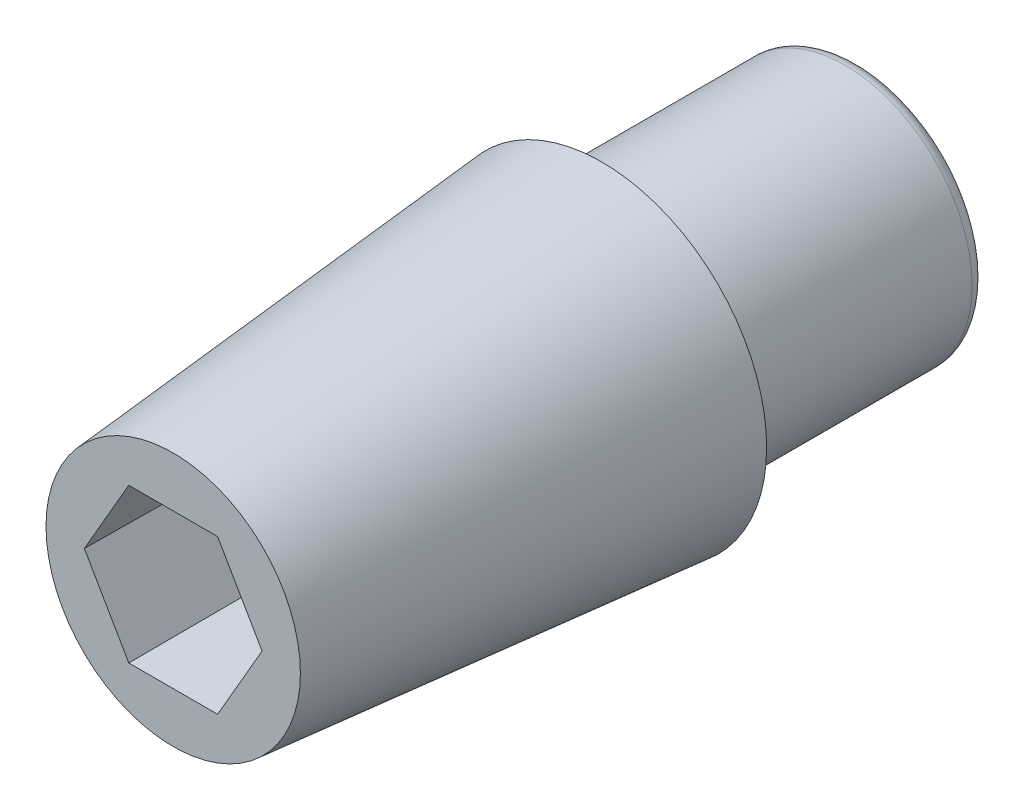
ISO-10303-21;
HEADER;
FILE_DESCRIPTION(('STEP AP214'),'2;1');
FILE_NAME('part.step','',(''),(''),'','','');
FILE_SCHEMA(('AUTOMOTIVE_DESIGN { 1 0 10303 214 1 1 1 1 }'));
ENDSEC;
DATA;
#1=APPLICATION_CONTEXT('core data for automotive mechanical design processes');
#2=APPLICATION_PROTOCOL_DEFINITION('international standard','automotive_design',2000,#1);
#3=PRODUCT_CONTEXT('',#1,'mechanical');
#4=PRODUCT('Part','Part','',(#3));
#5=PRODUCT_RELATED_PRODUCT_CATEGORY('part','',(#4));
#6=PRODUCT_DEFINITION_FORMATION('','',#4);
#7=PRODUCT_DEFINITION_CONTEXT('part definition',#1,'design');
#8=PRODUCT_DEFINITION('design','',#6,#7);
#9=PRODUCT_DEFINITION_SHAPE('','',#8);
#10=(LENGTH_UNIT() NAMED_UNIT(*) SI_UNIT(.MILLI.,.METRE.));
#11=(NAMED_UNIT(*) PLANE_ANGLE_UNIT() SI_UNIT($,.RADIAN.));
#12=(NAMED_UNIT(*) SI_UNIT($,.STERADIAN.) SOLID_ANGLE_UNIT());
#13=UNCERTAINTY_MEASURE_WITH_UNIT(LENGTH_MEASURE(1.E-05),#10,'distance_accuracy_value','');
#14=(GEOMETRIC_REPRESENTATION_CONTEXT(3) GLOBAL_UNCERTAINTY_ASSIGNED_CONTEXT((#13)) GLOBAL_UNIT_ASSIGNED_CONTEXT((#10,
#11,#12)) REPRESENTATION_CONTEXT('',''));
#15=CARTESIAN_POINT('',(0.,0.,0.));
#16=DIRECTION('',(0.,0.,1.));
#17=DIRECTION('',(1.,0.,0.));
#18=AXIS2_PLACEMENT_3D('',#15,#16,#17);
#19=CARTESIAN_POINT('',(0.,0.,15.));
#20=DIRECTION('',(0.,0.,-1.));
#21=DIRECTION('',(-1.,0.,0.));
#22=AXIS2_PLACEMENT_3D('',#19,#20,#21);
#23=CONICAL_SURFACE('',#22,4.44999999999141,0.0872664625001763);
#24=CARTESIAN_POINT('',(0.,0.,0.));
#25=DIRECTION('',(0.,0.,1.));
#26=DIRECTION('',(1.,0.,0.));
#27=AXIS2_PLACEMENT_3D('',#24,#25,#26);
#28=CIRCLE('',#27,5.76232995137573);
#29=CARTESIAN_POINT('',(5.76232995137573,0.,0.));
#30=VERTEX_POINT('',#29);
#31=EDGE_CURVE('E172',#30,#30,#28,.T.);
#32=ORIENTED_EDGE('',*,*,#31,.T.);
#33=EDGE_LOOP('',(#32));
#34=FACE_BOUND('',#33,.T.);
#35=CARTESIAN_POINT('',(0.,0.,15.));
#36=DIRECTION('',(0.,0.,1.));
#37=DIRECTION('',(1.,0.,0.));
#38=AXIS2_PLACEMENT_3D('',#35,#36,#37);
#39=CIRCLE('',#38,4.44999999999141);
#40=CARTESIAN_POINT('',(4.44999999999141,0.,15.));
#41=VERTEX_POINT('',#40);
#42=EDGE_CURVE('E168',#41,#41,#39,.T.);
#43=ORIENTED_EDGE('',*,*,#42,.F.);
#44=EDGE_LOOP('',(#43));
#45=FACE_BOUND('',#44,.T.);
#46=ADVANCED_FACE('F37',(#34,#45),#23,.T.);
#47=CARTESIAN_POINT('',(5.76232995137573,0.,0.));
#48=DIRECTION('',(0.,0.,-1.));
#49=DIRECTION('',(-1.,0.,0.));
#50=AXIS2_PLACEMENT_3D('',#47,#48,#49);
#51=PLANE('',#50);
#52=CARTESIAN_POINT('',(0.,0.,0.));
#53=DIRECTION('',(0.,0.,-1.));
#54=DIRECTION('',(-1.,0.,0.));
#55=AXIS2_PLACEMENT_3D('',#52,#53,#54);
#56=CIRCLE('',#55,4.45);
#57=CARTESIAN_POINT('',(-4.45,0.,0.));
#58=VERTEX_POINT('',#57);
#59=EDGE_CURVE('E137',#58,#58,#56,.T.);
#60=ORIENTED_EDGE('',*,*,#59,.F.);
#61=EDGE_LOOP('',(#60));
#62=FACE_BOUND('',#61,.T.);
#63=ORIENTED_EDGE('',*,*,#31,.F.);
#64=EDGE_LOOP('',(#63));
#65=FACE_BOUND('',#64,.T.);
#66=ADVANCED_FACE('F207',(#62,#65),#51,.T.);
#67=CARTESIAN_POINT('',(0.,0.,15.));
#68=DIRECTION('',(0.,0.,1.));
#69=DIRECTION('',(1.,0.,0.));
#70=AXIS2_PLACEMENT_3D('',#67,#68,#69);
#71=PLANE('',#70);
#72=DIRECTION('',(-0.499999999999999,0.866025403784439,0.));
#73=VECTOR('',#72,1.);
#74=CARTESIAN_POINT('',(3.10844356254791,0.,15.));
#75=LINE('',#74,#73);
#76=CARTESIAN_POINT('',(3.10844356254791,0.,15.));
#77=VERTEX_POINT('',#76);
#78=CARTESIAN_POINT('',(1.55422178127396,2.69199109139669,15.));
#79=VERTEX_POINT('',#78);
#80=EDGE_CURVE('E53',#77,#79,#75,.T.);
#81=ORIENTED_EDGE('',*,*,#80,.F.);
#82=DIRECTION('',(0.5,0.866025403784438,0.));
#83=VECTOR('',#82,1.);
#84=CARTESIAN_POINT('',(1.55422178127396,-2.6919910913967,15.));
#85=LINE('',#84,#83);
#86=CARTESIAN_POINT('',(1.55422178127396,-2.6919910913967,15.));
#87=VERTEX_POINT('',#86);
#88=EDGE_CURVE('E131',#87,#77,#85,.T.);
#89=ORIENTED_EDGE('',*,*,#88,.F.);
#90=DIRECTION('',(1.,0.,0.));
#91=VECTOR('',#90,1.);
#92=CARTESIAN_POINT('',(-1.55422178127395,-2.69199109139669,15.));
#93=LINE('',#92,#91);
#94=CARTESIAN_POINT('',(-1.55422178127395,-2.69199109139669,15.));
#95=VERTEX_POINT('',#94);
#96=EDGE_CURVE('E125',#95,#87,#93,.T.);
#97=ORIENTED_EDGE('',*,*,#96,.F.);
#98=DIRECTION('',(0.5,-0.866025403784439,0.));
#99=VECTOR('',#98,1.);
#100=CARTESIAN_POINT('',(-3.10844356254791,0.,15.));
#101=LINE('',#100,#99);
#102=CARTESIAN_POINT('',(-3.10844356254791,0.,15.));
#103=VERTEX_POINT('',#102);
#104=EDGE_CURVE('E119',#103,#95,#101,.T.);
#105=ORIENTED_EDGE('',*,*,#104,.F.);
#106=DIRECTION('',(-0.5,-0.866025403784439,0.));
#107=VECTOR('',#106,1.);
#108=CARTESIAN_POINT('',(-1.55422178127395,2.6919910913967,15.));
#109=LINE('',#108,#107);
#110=CARTESIAN_POINT('',(-1.55422178127395,2.6919910913967,15.));
#111=VERTEX_POINT('',#110);
#112=EDGE_CURVE('E100',#111,#103,#109,.T.);
#113=ORIENTED_EDGE('',*,*,#112,.F.);
#114=DIRECTION('',(-1.,0.,0.));
#115=VECTOR('',#114,1.);
#116=CARTESIAN_POINT('',(1.55422178127396,2.69199109139669,15.));
#117=LINE('',#116,#115);
#118=EDGE_CURVE('E110',#79,#111,#117,.T.);
#119=ORIENTED_EDGE('',*,*,#118,.F.);
#120=EDGE_LOOP('',(#81,#89,#97,#105,#113,#119));
#121=FACE_BOUND('',#120,.T.);
#122=ORIENTED_EDGE('',*,*,#42,.T.);
#123=EDGE_LOOP('',(#122));
#124=FACE_BOUND('',#123,.T.);
#125=ADVANCED_FACE('F115',(#121,#124),#71,.T.);
#126=CARTESIAN_POINT('',(0.,0.,-9.));
#127=DIRECTION('',(0.,0.,1.));
#128=DIRECTION('',(1.,0.,0.));
#129=AXIS2_PLACEMENT_3D('',#126,#127,#128);
#130=CYLINDRICAL_SURFACE('',#129,4.45);
#131=CARTESIAN_POINT('',(0.,0.,-8.5));
#132=DIRECTION('',(0.,0.,-1.));
#133=DIRECTION('',(-1.,0.,0.));
#134=AXIS2_PLACEMENT_3D('',#131,#132,#133);
#135=CIRCLE('',#134,4.45);
#136=CARTESIAN_POINT('',(-4.45,0.,-8.5));
#137=VERTEX_POINT('',#136);
#138=EDGE_CURVE('E11',#137,#137,#135,.F.);
#139=ORIENTED_EDGE('',*,*,#138,.T.);
#140=EDGE_LOOP('',(#139));
#141=FACE_BOUND('',#140,.T.);
#142=ORIENTED_EDGE('',*,*,#59,.T.);
#143=EDGE_LOOP('',(#142));
#144=FACE_BOUND('',#143,.T.);
#145=ADVANCED_FACE('F263',(#141,#144),#130,.T.);
#146=CARTESIAN_POINT('',(0.,0.,-9.));
#147=DIRECTION('',(0.,0.,-1.));
#148=DIRECTION('',(-1.,0.,0.));
#149=AXIS2_PLACEMENT_3D('',#146,#147,#148);
#150=PLANE('',#149);
#151=CARTESIAN_POINT('',(0.,0.,-9.));
#152=DIRECTION('',(0.,0.,-1.));
#153=DIRECTION('',(-1.,0.,0.));
#154=AXIS2_PLACEMENT_3D('',#151,#152,#153);
#155=CIRCLE('',#154,3.95);
#156=CARTESIAN_POINT('',(-3.95,0.,-9.));
#157=VERTEX_POINT('',#156);
#158=EDGE_CURVE('E46',#157,#157,#155,.T.);
#159=ORIENTED_EDGE('',*,*,#158,.T.);
#160=EDGE_LOOP('',(#159));
#161=FACE_BOUND('',#160,.T.);
#162=ADVANCED_FACE('F195',(#161),#150,.T.);
#163=CARTESIAN_POINT('',(3.10844356254791,0.,15.));
#164=DIRECTION('',(0.865992428190713,0.499980961532085,-0.00872653549837051));
#165=DIRECTION('',(-0.499999999999999,0.866025403784439,0.));
#166=AXIS2_PLACEMENT_3D('',#163,#164,#165);
#167=PLANE('',#166);
#168=ORIENTED_EDGE('',*,*,#80,.T.);
#169=DIRECTION('',(0.00503820367424761,0.00872642474267705,0.999949231718764));
#170=VECTOR('',#169,1.);
#171=CARTESIAN_POINT('',(1.5541428781084,2.69185442710508,14.9843398233026));
#172=LINE('',#171,#170);
#173=CARTESIAN_POINT('',(1.44337567297411,2.50000000000008,-7.));
#174=VERTEX_POINT('',#173);
#175=EDGE_CURVE('E78',#174,#79,#172,.T.);
#176=ORIENTED_EDGE('',*,*,#175,.F.);
#177=DIRECTION('',(-0.499999999999999,0.866025403784439,0.));
#178=VECTOR('',#177,1.);
#179=CARTESIAN_POINT('',(2.16506350946116,1.25000000000004,-7.));
#180=LINE('',#179,#178);
#181=CARTESIAN_POINT('',(2.88675134594822,0.,-7.));
#182=VERTEX_POINT('',#181);
#183=EDGE_CURVE('E134',#182,#174,#180,.T.);
#184=ORIENTED_EDGE('',*,*,#183,.F.);
#185=DIRECTION('',(0.0100764073484952,0.,0.999949231718764));
#186=VECTOR('',#185,1.);
#187=CARTESIAN_POINT('',(3.1082857562168,0.,14.9843398233026));
#188=LINE('',#187,#186);
#189=EDGE_CURVE('E61',#182,#77,#188,.T.);
#190=ORIENTED_EDGE('',*,*,#189,.T.);
#191=EDGE_LOOP('',(#168,#176,#184,#190));
#192=FACE_BOUND('',#191,.T.);
#193=ADVANCED_FACE('F243',(#192),#167,.F.);
#194=CARTESIAN_POINT('',(1.55422178127396,-2.6919910913967,15.));
#195=DIRECTION('',(0.865992428190713,-0.499980961532086,-0.00872653549837051));
#196=DIRECTION('',(0.5,0.866025403784439,0.));
#197=AXIS2_PLACEMENT_3D('',#194,#195,#196);
#198=PLANE('',#197);
#199=ORIENTED_EDGE('',*,*,#88,.T.);
#200=ORIENTED_EDGE('',*,*,#189,.F.);
#201=DIRECTION('',(0.5,0.866025403784439,0.));
#202=VECTOR('',#201,1.);
#203=CARTESIAN_POINT('',(2.16506350946116,-1.25000000000004,-7.));
#204=LINE('',#203,#202);
#205=CARTESIAN_POINT('',(1.44337567297411,-2.50000000000008,-7.));
#206=VERTEX_POINT('',#205);
#207=EDGE_CURVE('E139',#206,#182,#204,.T.);
#208=ORIENTED_EDGE('',*,*,#207,.F.);
#209=DIRECTION('',(0.00503820367424761,-0.00872642474267705,0.999949231718764));
#210=VECTOR('',#209,1.);
#211=CARTESIAN_POINT('',(1.5541428781084,-2.69185442710508,14.9843398233026));
#212=LINE('',#211,#210);
#213=EDGE_CURVE('E83',#206,#87,#212,.T.);
#214=ORIENTED_EDGE('',*,*,#213,.T.);
#215=EDGE_LOOP('',(#199,#200,#208,#214));
#216=FACE_BOUND('',#215,.T.);
#217=ADVANCED_FACE('F246',(#216),#198,.F.);
#218=CARTESIAN_POINT('',(-1.55422178127395,-2.69199109139669,15.));
#219=DIRECTION('',(0.,-0.999961923064171,-0.00872653549837051));
#220=DIRECTION('',(0.,0.00872653549837051,-0.999961923064171));
#221=AXIS2_PLACEMENT_3D('',#218,#219,#220);
#222=PLANE('',#221);
#223=ORIENTED_EDGE('',*,*,#96,.T.);
#224=ORIENTED_EDGE('',*,*,#213,.F.);
#225=DIRECTION('',(1.,0.,0.));
#226=VECTOR('',#225,1.);
#227=CARTESIAN_POINT('',(0.,-2.50000000000008,-7.));
#228=LINE('',#227,#226);
#229=CARTESIAN_POINT('',(-1.44337567297411,-2.50000000000008,-7.));
#230=VERTEX_POINT('',#229);
#231=EDGE_CURVE('E154',#230,#206,#228,.T.);
#232=ORIENTED_EDGE('',*,*,#231,.F.);
#233=DIRECTION('',(-0.00503820367424761,-0.00872642474267705,0.999949231718764));
#234=VECTOR('',#233,1.);
#235=CARTESIAN_POINT('',(-1.5541428781084,-2.69185442710508,14.9843398233026));
#236=LINE('',#235,#234);
#237=EDGE_CURVE('E143',#230,#95,#236,.T.);
#238=ORIENTED_EDGE('',*,*,#237,.T.);
#239=EDGE_LOOP('',(#223,#224,#232,#238));
#240=FACE_BOUND('',#239,.T.);
#241=ADVANCED_FACE('F254',(#240),#222,.F.);
#242=CARTESIAN_POINT('',(-3.10844356254791,0.,15.));
#243=DIRECTION('',(-0.865992428190713,-0.499980961532086,-0.00872653549837051));
#244=DIRECTION('',(0.5,-0.866025403784439,0.));
#245=AXIS2_PLACEMENT_3D('',#242,#243,#244);
#246=PLANE('',#245);
#247=ORIENTED_EDGE('',*,*,#104,.T.);
#248=ORIENTED_EDGE('',*,*,#237,.F.);
#249=DIRECTION('',(0.5,-0.866025403784439,0.));
#250=VECTOR('',#249,1.);
#251=CARTESIAN_POINT('',(-2.16506350946116,-1.25000000000004,-7.));
#252=LINE('',#251,#250);
#253=CARTESIAN_POINT('',(-2.88675134594822,0.,-7.));
#254=VERTEX_POINT('',#253);
#255=EDGE_CURVE('E158',#254,#230,#252,.T.);
#256=ORIENTED_EDGE('',*,*,#255,.F.);
#257=DIRECTION('',(-0.0100764073484952,0.,0.999949231718764));
#258=VECTOR('',#257,1.);
#259=CARTESIAN_POINT('',(-3.1082857562168,0.,14.9843398233026));
#260=LINE('',#259,#258);
#261=EDGE_CURVE('E107',#254,#103,#260,.T.);
#262=ORIENTED_EDGE('',*,*,#261,.T.);
#263=EDGE_LOOP('',(#247,#248,#256,#262));
#264=FACE_BOUND('',#263,.T.);
#265=ADVANCED_FACE('F251',(#264),#246,.F.);
#266=CARTESIAN_POINT('',(-1.55422178127395,2.6919910913967,15.));
#267=DIRECTION('',(-0.865992428190713,0.499980961532086,-0.00872653549837051));
#268=DIRECTION('',(-0.5,-0.866025403784439,0.));
#269=AXIS2_PLACEMENT_3D('',#266,#267,#268);
#270=PLANE('',#269);
#271=ORIENTED_EDGE('',*,*,#112,.T.);
#272=ORIENTED_EDGE('',*,*,#261,.F.);
#273=DIRECTION('',(-0.5,-0.866025403784439,0.));
#274=VECTOR('',#273,1.);
#275=CARTESIAN_POINT('',(-2.16506350946116,1.25000000000004,-7.));
#276=LINE('',#275,#274);
#277=CARTESIAN_POINT('',(-1.4433756729741,2.50000000000008,-7.));
#278=VERTEX_POINT('',#277);
#279=EDGE_CURVE('E103',#278,#254,#276,.T.);
#280=ORIENTED_EDGE('',*,*,#279,.F.);
#281=DIRECTION('',(-0.0050382036742476,0.00872642474267706,0.999949231718764));
#282=VECTOR('',#281,1.);
#283=CARTESIAN_POINT('',(-1.5541428781084,2.69185442710508,14.9843398233026));
#284=LINE('',#283,#282);
#285=EDGE_CURVE('E96',#278,#111,#284,.T.);
#286=ORIENTED_EDGE('',*,*,#285,.T.);
#287=EDGE_LOOP('',(#271,#272,#280,#286));
#288=FACE_BOUND('',#287,.T.);
#289=ADVANCED_FACE('F98',(#288),#270,.F.);
#290=CARTESIAN_POINT('',(1.55422178127396,2.69199109139669,15.));
#291=DIRECTION('',(0.,0.999961923064171,-0.00872653549837051));
#292=DIRECTION('',(0.,0.00872653549837051,0.999961923064171));
#293=AXIS2_PLACEMENT_3D('',#290,#291,#292);
#294=PLANE('',#293);
#295=ORIENTED_EDGE('',*,*,#118,.T.);
#296=ORIENTED_EDGE('',*,*,#285,.F.);
#297=DIRECTION('',(-1.,0.,0.));
#298=VECTOR('',#297,1.);
#299=CARTESIAN_POINT('',(0.,2.50000000000008,-7.));
#300=LINE('',#299,#298);
#301=EDGE_CURVE('E151',#174,#278,#300,.T.);
#302=ORIENTED_EDGE('',*,*,#301,.F.);
#303=ORIENTED_EDGE('',*,*,#175,.T.);
#304=EDGE_LOOP('',(#295,#296,#302,#303));
#305=FACE_BOUND('',#304,.T.);
#306=ADVANCED_FACE('F111',(#305),#294,.F.);
#307=CARTESIAN_POINT('',(0.,0.,-7.));
#308=DIRECTION('',(0.,0.,1.));
#309=DIRECTION('',(1.,0.,0.));
#310=AXIS2_PLACEMENT_3D('',#307,#308,#309);
#311=PLANE('',#310);
#312=CARTESIAN_POINT('',(0.,0.,-7.));
#313=DIRECTION('',(0.,0.,1.));
#314=DIRECTION('',(1.,0.,0.));
#315=AXIS2_PLACEMENT_3D('',#312,#313,#314);
#316=CIRCLE('',#315,0.591633117415918);
#317=CARTESIAN_POINT('',(0.591633117415916,0.,-7.));
#318=VERTEX_POINT('',#317);
#319=EDGE_CURVE('E188',#318,#318,#316,.F.);
#320=ORIENTED_EDGE('',*,*,#319,.T.);
#321=EDGE_LOOP('',(#320));
#322=FACE_BOUND('',#321,.T.);
#323=ORIENTED_EDGE('',*,*,#183,.T.);
#324=ORIENTED_EDGE('',*,*,#301,.T.);
#325=ORIENTED_EDGE('',*,*,#279,.T.);
#326=ORIENTED_EDGE('',*,*,#255,.T.);
#327=ORIENTED_EDGE('',*,*,#231,.T.);
#328=ORIENTED_EDGE('',*,*,#207,.T.);
#329=EDGE_LOOP('',(#323,#324,#325,#326,#327,#328));
#330=FACE_BOUND('',#329,.T.);
#331=ADVANCED_FACE('F233',(#322,#330),#311,.T.);
#332=CARTESIAN_POINT('',(0.,0.,-6.75));
#333=DIRECTION('',(0.,0.,-1.));
#334=DIRECTION('',(-1.,0.,0.));
#335=AXIS2_PLACEMENT_3D('',#332,#333,#334);
#336=CONICAL_SURFACE('',#335,0.478127834141649,0.0872664625437484);
#337=CARTESIAN_POINT('',(0.,0.,-6.84128442573081));
#338=DIRECTION('',(0.,0.,1.));
#339=DIRECTION('',(1.,0.,0.));
#340=AXIS2_PLACEMENT_3D('',#337,#338,#339);
#341=CIRCLE('',#340,0.48611418654442);
#342=CARTESIAN_POINT('',(0.486114186544418,0.,-6.84128442573081));
#343=VERTEX_POINT('',#342);
#344=EDGE_CURVE('E184',#343,#343,#341,.F.);
#345=ORIENTED_EDGE('',*,*,#344,.T.);
#346=EDGE_LOOP('',(#345));
#347=FACE_BOUND('',#346,.T.);
#348=CARTESIAN_POINT('',(0.,0.,-6.90871557426919));
#349=DIRECTION('',(0.,0.,-1.));
#350=DIRECTION('',(-1.,0.,0.));
#351=AXIS2_PLACEMENT_3D('',#348,#349,#350);
#352=CIRCLE('',#351,0.492013647606259);
#353=CARTESIAN_POINT('',(-0.492013647606261,0.,-6.90871557426919));
#354=VERTEX_POINT('',#353);
#355=EDGE_CURVE('E180',#354,#354,#352,.F.);
#356=ORIENTED_EDGE('',*,*,#355,.T.);
#357=EDGE_LOOP('',(#356));
#358=FACE_BOUND('',#357,.T.);
#359=ADVANCED_FACE('F224',(#347,#358),#336,.T.);
#360=CARTESIAN_POINT('',(0.,0.,-6.75));
#361=DIRECTION('',(0.,0.,1.));
#362=DIRECTION('',(1.,0.,0.));
#363=AXIS2_PLACEMENT_3D('',#360,#361,#362);
#364=PLANE('',#363);
#365=CARTESIAN_POINT('',(0.,0.,-6.75));
#366=DIRECTION('',(0.,0.,1.));
#367=DIRECTION('',(1.,0.,0.));
#368=AXIS2_PLACEMENT_3D('',#365,#366,#367);
#369=CIRCLE('',#368,0.386494716734761);
#370=CARTESIAN_POINT('',(0.386494716734759,0.,-6.75));
#371=VERTEX_POINT('',#370);
#372=EDGE_CURVE('E176',#371,#371,#369,.T.);
#373=ORIENTED_EDGE('',*,*,#372,.T.);
#374=EDGE_LOOP('',(#373));
#375=FACE_BOUND('',#374,.T.);
#376=ADVANCED_FACE('F219',(#375),#364,.T.);
#377=CARTESIAN_POINT('',(0.,0.,-6.85));
#378=DIRECTION('',(0.,0.,1.));
#379=DIRECTION('',(1.,0.,0.));
#380=AXIS2_PLACEMENT_3D('',#377,#378,#379);
#381=TOROIDAL_SURFACE('',#380,0.386494716734761,0.0999999999999965);
#382=ORIENTED_EDGE('',*,*,#344,.F.);
#383=EDGE_LOOP('',(#382));
#384=FACE_BOUND('',#383,.T.);
#385=ORIENTED_EDGE('',*,*,#372,.F.);
#386=EDGE_LOOP('',(#385));
#387=FACE_BOUND('',#386,.T.);
#388=ADVANCED_FACE('F203',(#384,#387),#381,.T.);
#389=CARTESIAN_POINT('',(0.,0.,-6.9));
#390=DIRECTION('',(0.,0.,1.));
#391=DIRECTION('',(1.,0.,0.));
#392=AXIS2_PLACEMENT_3D('',#389,#390,#391);
#393=TOROIDAL_SURFACE('',#392,0.591633117415918,0.0999999999999965);
#394=ORIENTED_EDGE('',*,*,#319,.F.);
#395=EDGE_LOOP('',(#394));
#396=FACE_BOUND('',#395,.T.);
#397=ORIENTED_EDGE('',*,*,#355,.F.);
#398=EDGE_LOOP('',(#397));
#399=FACE_BOUND('',#398,.T.);
#400=ADVANCED_FACE('F198',(#396,#399),#393,.F.);
#401=CARTESIAN_POINT('',(0.,0.,-8.5));
#402=DIRECTION('',(0.,0.,-1.));
#403=DIRECTION('',(-1.,0.,0.));
#404=AXIS2_PLACEMENT_3D('',#401,#402,#403);
#405=TOROIDAL_SURFACE('',#404,3.95,0.5);
#406=ORIENTED_EDGE('',*,*,#138,.F.);
#407=EDGE_LOOP('',(#406));
#408=FACE_BOUND('',#407,.T.);
#409=ORIENTED_EDGE('',*,*,#158,.F.);
#410=EDGE_LOOP('',(#409));
#411=FACE_BOUND('',#410,.T.);
#412=ADVANCED_FACE('F39',(#408,#411),#405,.T.);
#413=CLOSED_SHELL('',(#46,#66,#125,#145,#162,#193,#217,#241,#265,#289,#306,#331,#359,#376,#388,
#400,#412));
#414=MANIFOLD_SOLID_BREP('B2',#413);
#415=ADVANCED_BREP_SHAPE_REPRESENTATION('',(#18,#414),#14);
#416=SHAPE_DEFINITION_REPRESENTATION(#9,#415);
ENDSEC;
END-ISO-10303-21;
